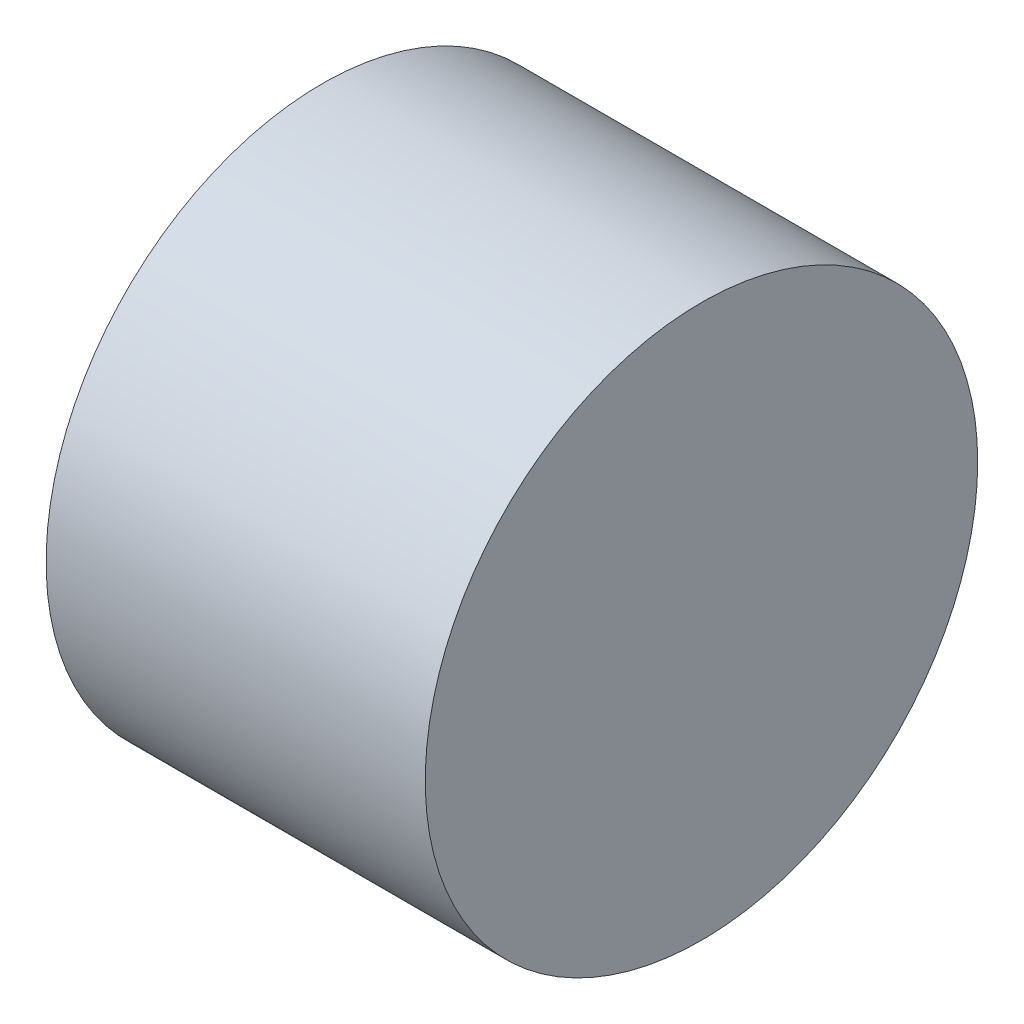
ISO-10303-21;
HEADER;
FILE_DESCRIPTION(('STEP AP214'),'2;1');
FILE_NAME('part.step','',(''),(''),'','','');
FILE_SCHEMA(('AUTOMOTIVE_DESIGN { 1 0 10303 214 1 1 1 1 }'));
ENDSEC;
DATA;
#1=APPLICATION_CONTEXT('core data for automotive mechanical design processes');
#2=APPLICATION_PROTOCOL_DEFINITION('international standard','automotive_design',2000,#1);
#3=PRODUCT_CONTEXT('',#1,'mechanical');
#4=PRODUCT('Part','Part','',(#3));
#5=PRODUCT_RELATED_PRODUCT_CATEGORY('part','',(#4));
#6=PRODUCT_DEFINITION_FORMATION('','',#4);
#7=PRODUCT_DEFINITION_CONTEXT('part definition',#1,'design');
#8=PRODUCT_DEFINITION('design','',#6,#7);
#9=PRODUCT_DEFINITION_SHAPE('','',#8);
#10=(LENGTH_UNIT() NAMED_UNIT(*) SI_UNIT(.MILLI.,.METRE.));
#11=(NAMED_UNIT(*) PLANE_ANGLE_UNIT() SI_UNIT($,.RADIAN.));
#12=(NAMED_UNIT(*) SI_UNIT($,.STERADIAN.) SOLID_ANGLE_UNIT());
#13=UNCERTAINTY_MEASURE_WITH_UNIT(LENGTH_MEASURE(1.E-05),#10,'distance_accuracy_value','');
#14=(GEOMETRIC_REPRESENTATION_CONTEXT(3) GLOBAL_UNCERTAINTY_ASSIGNED_CONTEXT((#13)) GLOBAL_UNIT_ASSIGNED_CONTEXT((#10,
#11,#12)) REPRESENTATION_CONTEXT('',''));
#15=CARTESIAN_POINT('',(0.,0.,0.));
#16=DIRECTION('',(0.,0.,1.));
#17=DIRECTION('',(1.,0.,0.));
#18=AXIS2_PLACEMENT_3D('',#15,#16,#17);
#19=CARTESIAN_POINT('',(35.,0.,0.));
#20=DIRECTION('',(-1.,0.,0.));
#21=DIRECTION('',(0.,0.,1.));
#22=AXIS2_PLACEMENT_3D('',#19,#20,#21);
#23=CYLINDRICAL_SURFACE('',#22,25.5);
#24=CARTESIAN_POINT('',(35.,0.,0.));
#25=DIRECTION('',(1.,0.,0.));
#26=DIRECTION('',(0.,0.,-1.));
#27=AXIS2_PLACEMENT_3D('',#24,#25,#26);
#28=CIRCLE('',#27,25.5);
#29=CARTESIAN_POINT('',(35.,0.,-25.5));
#30=VERTEX_POINT('',#29);
#31=EDGE_CURVE('E10',#30,#30,#28,.T.);
#32=ORIENTED_EDGE('',*,*,#31,.F.);
#33=EDGE_LOOP('',(#32));
#34=FACE_BOUND('',#33,.T.);
#35=CARTESIAN_POINT('',(0.,0.,0.));
#36=DIRECTION('',(1.,0.,0.));
#37=DIRECTION('',(0.,0.,-1.));
#38=AXIS2_PLACEMENT_3D('',#35,#36,#37);
#39=CIRCLE('',#38,25.5);
#40=CARTESIAN_POINT('',(0.,0.,-25.5));
#41=VERTEX_POINT('',#40);
#42=EDGE_CURVE('E38',#41,#41,#39,.T.);
#43=ORIENTED_EDGE('',*,*,#42,.T.);
#44=EDGE_LOOP('',(#43));
#45=FACE_BOUND('',#44,.T.);
#46=ADVANCED_FACE('F35',(#34,#45),#23,.T.);
#47=CARTESIAN_POINT('',(35.,0.,0.));
#48=DIRECTION('',(1.,0.,0.));
#49=DIRECTION('',(0.,0.,-1.));
#50=AXIS2_PLACEMENT_3D('',#47,#48,#49);
#51=PLANE('',#50);
#52=ORIENTED_EDGE('',*,*,#31,.T.);
#53=EDGE_LOOP('',(#52));
#54=FACE_BOUND('',#53,.T.);
#55=ADVANCED_FACE('F50',(#54),#51,.T.);
#56=CARTESIAN_POINT('',(0.,0.,0.));
#57=DIRECTION('',(1.,0.,0.));
#58=DIRECTION('',(0.,0.,-1.));
#59=AXIS2_PLACEMENT_3D('',#56,#57,#58);
#60=PLANE('',#59);
#61=ORIENTED_EDGE('',*,*,#42,.F.);
#62=EDGE_LOOP('',(#61));
#63=FACE_BOUND('',#62,.T.);
#64=ADVANCED_FACE('F48',(#63),#60,.F.);
#65=CLOSED_SHELL('',(#46,#55,#64));
#66=MANIFOLD_SOLID_BREP('B2',#65);
#67=ADVANCED_BREP_SHAPE_REPRESENTATION('',(#18,#66),#14);
#68=SHAPE_DEFINITION_REPRESENTATION(#9,#67);
ENDSEC;
END-ISO-10303-21;
